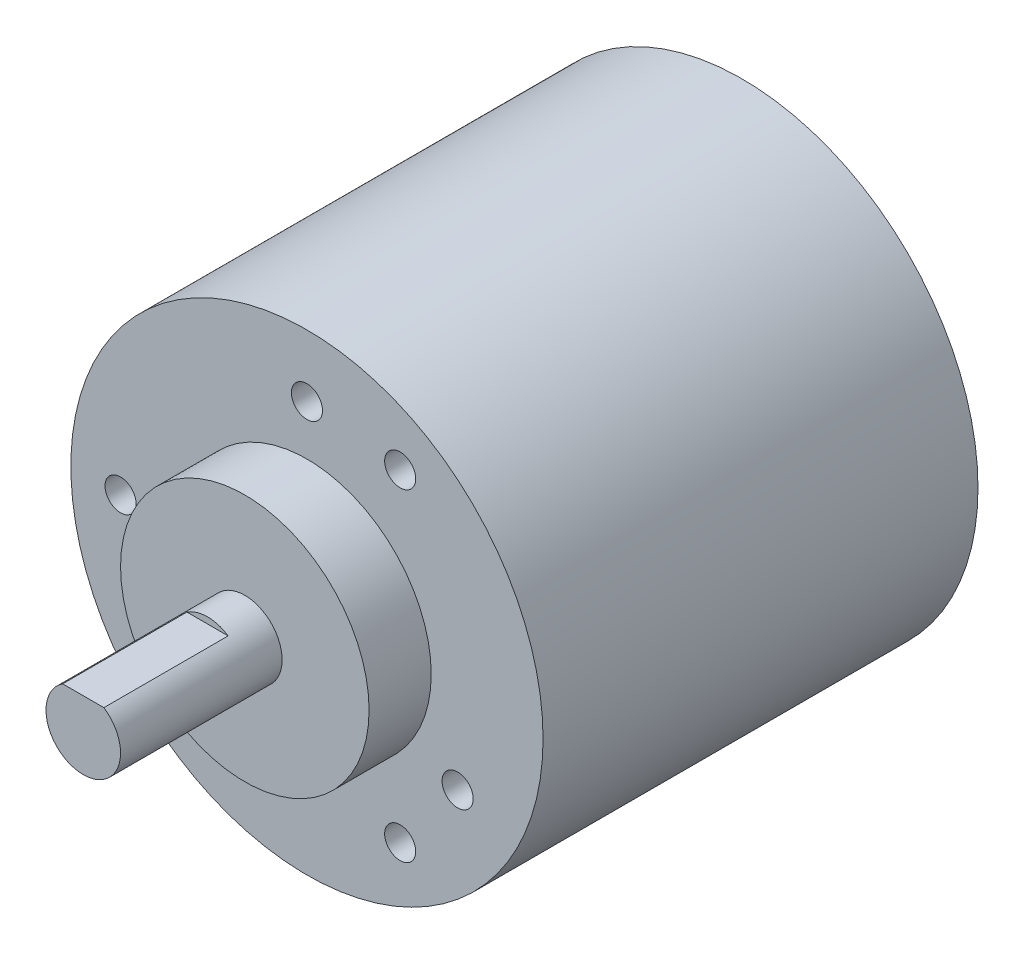
ISO-10303-21;
HEADER;
FILE_DESCRIPTION(('STEP AP214'),'2;1');
FILE_NAME('part.step','',(''),(''),'','','');
FILE_SCHEMA(('AUTOMOTIVE_DESIGN { 1 0 10303 214 1 1 1 1 }'));
ENDSEC;
DATA;
#1=APPLICATION_CONTEXT('core data for automotive mechanical design processes');
#2=APPLICATION_PROTOCOL_DEFINITION('international standard','automotive_design',2000,#1);
#3=PRODUCT_CONTEXT('',#1,'mechanical');
#4=PRODUCT('Part','Part','',(#3));
#5=PRODUCT_RELATED_PRODUCT_CATEGORY('part','',(#4));
#6=PRODUCT_DEFINITION_FORMATION('','',#4);
#7=PRODUCT_DEFINITION_CONTEXT('part definition',#1,'design');
#8=PRODUCT_DEFINITION('design','',#6,#7);
#9=PRODUCT_DEFINITION_SHAPE('','',#8);
#10=(LENGTH_UNIT() NAMED_UNIT(*) SI_UNIT(.MILLI.,.METRE.));
#11=(NAMED_UNIT(*) PLANE_ANGLE_UNIT() SI_UNIT($,.RADIAN.));
#12=(NAMED_UNIT(*) SI_UNIT($,.STERADIAN.) SOLID_ANGLE_UNIT());
#13=UNCERTAINTY_MEASURE_WITH_UNIT(LENGTH_MEASURE(1.E-05),#10,'distance_accuracy_value','');
#14=(GEOMETRIC_REPRESENTATION_CONTEXT(3) GLOBAL_UNCERTAINTY_ASSIGNED_CONTEXT((#13)) GLOBAL_UNIT_ASSIGNED_CONTEXT((#10,
#11,#12)) REPRESENTATION_CONTEXT('',''));
#15=CARTESIAN_POINT('',(0.,0.,0.));
#16=DIRECTION('',(0.,0.,1.));
#17=DIRECTION('',(1.,0.,0.));
#18=AXIS2_PLACEMENT_3D('',#15,#16,#17);
#19=CARTESIAN_POINT('',(0.,0.,35.));
#20=DIRECTION('',(0.,0.,-1.));
#21=DIRECTION('',(-1.,0.,0.));
#22=AXIS2_PLACEMENT_3D('',#19,#20,#21);
#23=CYLINDRICAL_SURFACE('',#22,19.);
#24=CARTESIAN_POINT('',(0.,0.,35.));
#25=DIRECTION('',(0.,0.,1.));
#26=DIRECTION('',(1.,0.,0.));
#27=AXIS2_PLACEMENT_3D('',#24,#25,#26);
#28=CIRCLE('',#27,19.);
#29=CARTESIAN_POINT('',(19.,0.,35.));
#30=VERTEX_POINT('',#29);
#31=EDGE_CURVE('E173',#30,#30,#28,.T.);
#32=ORIENTED_EDGE('',*,*,#31,.F.);
#33=EDGE_LOOP('',(#32));
#34=FACE_BOUND('',#33,.T.);
#35=CARTESIAN_POINT('',(0.,0.,0.));
#36=DIRECTION('',(0.,0.,1.));
#37=DIRECTION('',(1.,0.,0.));
#38=AXIS2_PLACEMENT_3D('',#35,#36,#37);
#39=CIRCLE('',#38,19.);
#40=CARTESIAN_POINT('',(19.,0.,0.));
#41=VERTEX_POINT('',#40);
#42=EDGE_CURVE('E48',#41,#41,#39,.T.);
#43=ORIENTED_EDGE('',*,*,#42,.T.);
#44=EDGE_LOOP('',(#43));
#45=FACE_BOUND('',#44,.T.);
#46=ADVANCED_FACE('F45',(#34,#45),#23,.T.);
#47=CARTESIAN_POINT('',(0.,0.,35.));
#48=DIRECTION('',(0.,0.,1.));
#49=DIRECTION('',(1.,0.,0.));
#50=AXIS2_PLACEMENT_3D('',#47,#48,#49);
#51=PLANE('',#50);
#52=CARTESIAN_POINT('',(0.,14.,35.));
#53=DIRECTION('',(0.,0.,1.));
#54=DIRECTION('',(1.,0.,0.));
#55=AXIS2_PLACEMENT_3D('',#52,#53,#54);
#56=CIRCLE('',#55,1.24999999999999);
#57=CARTESIAN_POINT('',(1.24999999999999,14.,35.));
#58=VERTEX_POINT('',#57);
#59=EDGE_CURVE('E106',#58,#58,#56,.T.);
#60=ORIENTED_EDGE('',*,*,#59,.F.);
#61=EDGE_LOOP('',(#60));
#62=FACE_BOUND('',#61,.T.);
#63=CARTESIAN_POINT('',(7.49999999999992,12.9903810567666,35.));
#64=DIRECTION('',(0.,0.,1.));
#65=DIRECTION('',(1.,0.,0.));
#66=AXIS2_PLACEMENT_3D('',#63,#64,#65);
#67=CIRCLE('',#66,1.24999999999999);
#68=CARTESIAN_POINT('',(8.74999999999991,12.9903810567666,35.));
#69=VERTEX_POINT('',#68);
#70=EDGE_CURVE('E105',#69,#69,#67,.T.);
#71=ORIENTED_EDGE('',*,*,#70,.F.);
#72=EDGE_LOOP('',(#71));
#73=FACE_BOUND('',#72,.T.);
#74=CARTESIAN_POINT('',(12.1243556529821,-7.,35.));
#75=DIRECTION('',(0.,0.,1.));
#76=DIRECTION('',(1.,0.,0.));
#77=AXIS2_PLACEMENT_3D('',#74,#75,#76);
#78=CIRCLE('',#77,1.24999999999999);
#79=CARTESIAN_POINT('',(13.3743556529821,-7.,35.));
#80=VERTEX_POINT('',#79);
#81=EDGE_CURVE('E119',#80,#80,#78,.T.);
#82=ORIENTED_EDGE('',*,*,#81,.F.);
#83=EDGE_LOOP('',(#82));
#84=FACE_BOUND('',#83,.T.);
#85=CARTESIAN_POINT('',(7.50000000000008,-12.9903810567665,35.));
#86=DIRECTION('',(0.,0.,1.));
#87=DIRECTION('',(1.,0.,0.));
#88=AXIS2_PLACEMENT_3D('',#85,#86,#87);
#89=CIRCLE('',#88,1.24999999999999);
#90=CARTESIAN_POINT('',(8.75000000000007,-12.9903810567665,35.));
#91=VERTEX_POINT('',#90);
#92=EDGE_CURVE('E127',#91,#91,#89,.T.);
#93=ORIENTED_EDGE('',*,*,#92,.F.);
#94=EDGE_LOOP('',(#93));
#95=FACE_BOUND('',#94,.T.);
#96=CARTESIAN_POINT('',(-12.1243556529821,-7.,35.));
#97=DIRECTION('',(0.,0.,1.));
#98=DIRECTION('',(1.,0.,0.));
#99=AXIS2_PLACEMENT_3D('',#96,#97,#98);
#100=CIRCLE('',#99,1.24999999999999);
#101=CARTESIAN_POINT('',(-10.8743556529822,-7.,35.));
#102=VERTEX_POINT('',#101);
#103=EDGE_CURVE('E135',#102,#102,#100,.T.);
#104=ORIENTED_EDGE('',*,*,#103,.F.);
#105=EDGE_LOOP('',(#104));
#106=FACE_BOUND('',#105,.T.);
#107=CARTESIAN_POINT('',(-15.,-1.02362217812214E-13,35.));
#108=DIRECTION('',(0.,0.,1.));
#109=DIRECTION('',(1.,0.,0.));
#110=AXIS2_PLACEMENT_3D('',#107,#108,#109);
#111=CIRCLE('',#110,1.24999999999999);
#112=CARTESIAN_POINT('',(-13.75,-1.02362217812214E-13,35.));
#113=VERTEX_POINT('',#112);
#114=EDGE_CURVE('E143',#113,#113,#111,.T.);
#115=ORIENTED_EDGE('',*,*,#114,.F.);
#116=EDGE_LOOP('',(#115));
#117=FACE_BOUND('',#116,.T.);
#118=CARTESIAN_POINT('',(0.,0.,35.));
#119=DIRECTION('',(0.,0.,1.));
#120=DIRECTION('',(1.,0.,0.));
#121=AXIS2_PLACEMENT_3D('',#118,#119,#120);
#122=CIRCLE('',#121,10.);
#123=CARTESIAN_POINT('',(10.,0.,35.));
#124=VERTEX_POINT('',#123);
#125=EDGE_CURVE('E54',#124,#124,#122,.T.);
#126=ORIENTED_EDGE('',*,*,#125,.F.);
#127=EDGE_LOOP('',(#126));
#128=FACE_BOUND('',#127,.T.);
#129=ORIENTED_EDGE('',*,*,#31,.T.);
#130=EDGE_LOOP('',(#129));
#131=FACE_BOUND('',#130,.T.);
#132=ADVANCED_FACE('F186',(#62,#73,#84,#95,#106,#117,#128,#131),#51,.T.);
#133=CARTESIAN_POINT('',(0.,0.,0.));
#134=DIRECTION('',(0.,0.,1.));
#135=DIRECTION('',(1.,0.,0.));
#136=AXIS2_PLACEMENT_3D('',#133,#134,#135);
#137=PLANE('',#136);
#138=ORIENTED_EDGE('',*,*,#42,.F.);
#139=EDGE_LOOP('',(#138));
#140=FACE_BOUND('',#139,.T.);
#141=ADVANCED_FACE('F183',(#140),#137,.F.);
#142=CARTESIAN_POINT('',(0.,0.,40.));
#143=DIRECTION('',(0.,0.,-1.));
#144=DIRECTION('',(-1.,0.,0.));
#145=AXIS2_PLACEMENT_3D('',#142,#143,#144);
#146=CYLINDRICAL_SURFACE('',#145,10.);
#147=CARTESIAN_POINT('',(0.,0.,40.));
#148=DIRECTION('',(0.,0.,1.));
#149=DIRECTION('',(1.,0.,0.));
#150=AXIS2_PLACEMENT_3D('',#147,#148,#149);
#151=CIRCLE('',#150,10.);
#152=CARTESIAN_POINT('',(10.,0.,40.));
#153=VERTEX_POINT('',#152);
#154=EDGE_CURVE('E166',#153,#153,#151,.T.);
#155=ORIENTED_EDGE('',*,*,#154,.F.);
#156=EDGE_LOOP('',(#155));
#157=FACE_BOUND('',#156,.T.);
#158=ORIENTED_EDGE('',*,*,#125,.T.);
#159=EDGE_LOOP('',(#158));
#160=FACE_BOUND('',#159,.T.);
#161=ADVANCED_FACE('F185',(#157,#160),#146,.T.);
#162=CARTESIAN_POINT('',(0.,0.,40.));
#163=DIRECTION('',(0.,0.,1.));
#164=DIRECTION('',(1.,0.,0.));
#165=AXIS2_PLACEMENT_3D('',#162,#163,#164);
#166=PLANE('',#165);
#167=CARTESIAN_POINT('',(0.,0.,40.));
#168=DIRECTION('',(0.,0.,1.));
#169=DIRECTION('',(1.,0.,0.));
#170=AXIS2_PLACEMENT_3D('',#167,#168,#169);
#171=CIRCLE('',#170,3.);
#172=CARTESIAN_POINT('',(3.,0.,40.));
#173=VERTEX_POINT('',#172);
#174=EDGE_CURVE('E11',#173,#173,#171,.T.);
#175=ORIENTED_EDGE('',*,*,#174,.F.);
#176=EDGE_LOOP('',(#175));
#177=FACE_BOUND('',#176,.T.);
#178=ORIENTED_EDGE('',*,*,#154,.T.);
#179=EDGE_LOOP('',(#178));
#180=FACE_BOUND('',#179,.T.);
#181=ADVANCED_FACE('F191',(#177,#180),#166,.T.);
#182=CARTESIAN_POINT('',(0.,0.,53.));
#183=DIRECTION('',(0.,0.,-1.));
#184=DIRECTION('',(-1.,0.,0.));
#185=AXIS2_PLACEMENT_3D('',#182,#183,#184);
#186=CYLINDRICAL_SURFACE('',#185,3.);
#187=CARTESIAN_POINT('',(0.,0.,53.));
#188=DIRECTION('',(0.,0.,1.));
#189=DIRECTION('',(1.,0.,0.));
#190=AXIS2_PLACEMENT_3D('',#187,#188,#189);
#191=CIRCLE('',#190,3.);
#192=CARTESIAN_POINT('',(-1.6583123951777,2.5,53.));
#193=VERTEX_POINT('',#192);
#194=CARTESIAN_POINT('',(1.6583123951777,2.5,53.));
#195=VERTEX_POINT('',#194);
#196=EDGE_CURVE('E161',#193,#195,#191,.T.);
#197=ORIENTED_EDGE('',*,*,#196,.F.);
#198=DIRECTION('',(0.,0.,1.));
#199=VECTOR('',#198,1.);
#200=CARTESIAN_POINT('',(-1.6583123951777,2.5,43.));
#201=LINE('',#200,#199);
#202=CARTESIAN_POINT('',(-1.6583123951777,2.5,43.));
#203=VERTEX_POINT('',#202);
#204=EDGE_CURVE('E62',#203,#193,#201,.T.);
#205=ORIENTED_EDGE('',*,*,#204,.F.);
#206=CARTESIAN_POINT('',(0.,0.,43.));
#207=DIRECTION('',(0.,0.,1.));
#208=DIRECTION('',(1.,0.,0.));
#209=AXIS2_PLACEMENT_3D('',#206,#207,#208);
#210=CIRCLE('',#209,3.);
#211=CARTESIAN_POINT('',(1.6583123951777,2.5,43.));
#212=VERTEX_POINT('',#211);
#213=EDGE_CURVE('E151',#212,#203,#210,.T.);
#214=ORIENTED_EDGE('',*,*,#213,.F.);
#215=DIRECTION('',(0.,0.,1.));
#216=VECTOR('',#215,1.);
#217=CARTESIAN_POINT('',(1.6583123951777,2.5,43.));
#218=LINE('',#217,#216);
#219=EDGE_CURVE('E68',#212,#195,#218,.T.);
#220=ORIENTED_EDGE('',*,*,#219,.T.);
#221=EDGE_LOOP('',(#197,#205,#214,#220));
#222=FACE_BOUND('',#221,.T.);
#223=ORIENTED_EDGE('',*,*,#174,.T.);
#224=EDGE_LOOP('',(#223));
#225=FACE_BOUND('',#224,.T.);
#226=ADVANCED_FACE('F335',(#222,#225),#186,.T.);
#227=CARTESIAN_POINT('',(0.,0.,53.));
#228=DIRECTION('',(0.,0.,1.));
#229=DIRECTION('',(1.,0.,0.));
#230=AXIS2_PLACEMENT_3D('',#227,#228,#229);
#231=PLANE('',#230);
#232=DIRECTION('',(1.,0.,0.));
#233=VECTOR('',#232,1.);
#234=CARTESIAN_POINT('',(-1.6583123951777,2.5,53.));
#235=LINE('',#234,#233);
#236=EDGE_CURVE('E75',#193,#195,#235,.T.);
#237=ORIENTED_EDGE('',*,*,#236,.F.);
#238=ORIENTED_EDGE('',*,*,#196,.T.);
#239=EDGE_LOOP('',(#237,#238));
#240=FACE_BOUND('',#239,.T.);
#241=ADVANCED_FACE('F328',(#240),#231,.T.);
#242=CARTESIAN_POINT('',(-1.6583123951777,2.5,43.));
#243=DIRECTION('',(0.,-1.,0.));
#244=DIRECTION('',(0.,0.,-1.));
#245=AXIS2_PLACEMENT_3D('',#242,#243,#244);
#246=PLANE('',#245);
#247=ORIENTED_EDGE('',*,*,#236,.T.);
#248=ORIENTED_EDGE('',*,*,#219,.F.);
#249=DIRECTION('',(1.,0.,0.));
#250=VECTOR('',#249,1.);
#251=CARTESIAN_POINT('',(-1.6583123951777,2.5,43.));
#252=LINE('',#251,#250);
#253=EDGE_CURVE('E154',#203,#212,#252,.T.);
#254=ORIENTED_EDGE('',*,*,#253,.F.);
#255=ORIENTED_EDGE('',*,*,#204,.T.);
#256=EDGE_LOOP('',(#247,#248,#254,#255));
#257=FACE_BOUND('',#256,.T.);
#258=ADVANCED_FACE('F320',(#257),#246,.F.);
#259=CARTESIAN_POINT('',(0.,0.,43.));
#260=DIRECTION('',(0.,0.,1.));
#261=DIRECTION('',(1.,0.,0.));
#262=AXIS2_PLACEMENT_3D('',#259,#260,#261);
#263=PLANE('',#262);
#264=ORIENTED_EDGE('',*,*,#213,.T.);
#265=ORIENTED_EDGE('',*,*,#253,.T.);
#266=EDGE_LOOP('',(#264,#265));
#267=FACE_BOUND('',#266,.T.);
#268=ADVANCED_FACE('F312',(#267),#263,.T.);
#269=CARTESIAN_POINT('',(-15.,-1.02362217812214E-13,27.5));
#270=DIRECTION('',(0.,0.,1.));
#271=DIRECTION('',(1.,0.,0.));
#272=AXIS2_PLACEMENT_3D('',#269,#270,#271);
#273=CONICAL_SURFACE('',#272,1.25,1.02974425867665);
#274=CARTESIAN_POINT('',(-15.,-1.02362217812214E-13,26.7489242262156));
#275=VERTEX_POINT('',#274);
#276=VERTEX_LOOP('',#275);
#277=FACE_BOUND('',#276,.T.);
#278=CARTESIAN_POINT('',(-15.,-1.02362217812214E-13,27.5));
#279=DIRECTION('',(0.,0.,1.));
#280=DIRECTION('',(1.,0.,0.));
#281=AXIS2_PLACEMENT_3D('',#278,#279,#280);
#282=CIRCLE('',#281,1.25);
#283=CARTESIAN_POINT('',(-13.75,-1.02362217812214E-13,27.5));
#284=VERTEX_POINT('',#283);
#285=EDGE_CURVE('E147',#284,#284,#282,.T.);
#286=ORIENTED_EDGE('',*,*,#285,.T.);
#287=EDGE_LOOP('',(#286));
#288=FACE_BOUND('',#287,.T.);
#289=ADVANCED_FACE('F303',(#277,#288),#273,.F.);
#290=CARTESIAN_POINT('',(-15.,-1.02362217812214E-13,35.));
#291=DIRECTION('',(0.,0.,1.));
#292=DIRECTION('',(1.,0.,0.));
#293=AXIS2_PLACEMENT_3D('',#290,#291,#292);
#294=CYLINDRICAL_SURFACE('',#293,1.24999999999999);
#295=ORIENTED_EDGE('',*,*,#285,.F.);
#296=EDGE_LOOP('',(#295));
#297=FACE_BOUND('',#296,.T.);
#298=ORIENTED_EDGE('',*,*,#114,.T.);
#299=EDGE_LOOP('',(#298));
#300=FACE_BOUND('',#299,.T.);
#301=ADVANCED_FACE('F294',(#297,#300),#294,.F.);
#302=CARTESIAN_POINT('',(-12.1243556529821,-7.,27.5));
#303=DIRECTION('',(0.,0.,1.));
#304=DIRECTION('',(1.,0.,0.));
#305=AXIS2_PLACEMENT_3D('',#302,#303,#304);
#306=CONICAL_SURFACE('',#305,1.25,1.02974425867665);
#307=CARTESIAN_POINT('',(-12.1243556529821,-7.,26.7489242262156));
#308=VERTEX_POINT('',#307);
#309=VERTEX_LOOP('',#308);
#310=FACE_BOUND('',#309,.T.);
#311=CARTESIAN_POINT('',(-12.1243556529821,-7.,27.5));
#312=DIRECTION('',(0.,0.,1.));
#313=DIRECTION('',(1.,0.,0.));
#314=AXIS2_PLACEMENT_3D('',#311,#312,#313);
#315=CIRCLE('',#314,1.25);
#316=CARTESIAN_POINT('',(-10.8743556529821,-7.,27.5));
#317=VERTEX_POINT('',#316);
#318=EDGE_CURVE('E139',#317,#317,#315,.T.);
#319=ORIENTED_EDGE('',*,*,#318,.T.);
#320=EDGE_LOOP('',(#319));
#321=FACE_BOUND('',#320,.T.);
#322=ADVANCED_FACE('F284',(#310,#321),#306,.F.);
#323=CARTESIAN_POINT('',(-12.1243556529821,-7.,35.));
#324=DIRECTION('',(0.,0.,1.));
#325=DIRECTION('',(1.,0.,0.));
#326=AXIS2_PLACEMENT_3D('',#323,#324,#325);
#327=CYLINDRICAL_SURFACE('',#326,1.24999999999999);
#328=ORIENTED_EDGE('',*,*,#318,.F.);
#329=EDGE_LOOP('',(#328));
#330=FACE_BOUND('',#329,.T.);
#331=ORIENTED_EDGE('',*,*,#103,.T.);
#332=EDGE_LOOP('',(#331));
#333=FACE_BOUND('',#332,.T.);
#334=ADVANCED_FACE('F275',(#330,#333),#327,.F.);
#335=CARTESIAN_POINT('',(7.50000000000008,-12.9903810567665,27.5));
#336=DIRECTION('',(0.,0.,1.));
#337=DIRECTION('',(1.,0.,0.));
#338=AXIS2_PLACEMENT_3D('',#335,#336,#337);
#339=CONICAL_SURFACE('',#338,1.25,1.02974425867665);
#340=CARTESIAN_POINT('',(7.50000000000008,-12.9903810567665,26.7489242262156));
#341=VERTEX_POINT('',#340);
#342=VERTEX_LOOP('',#341);
#343=FACE_BOUND('',#342,.T.);
#344=CARTESIAN_POINT('',(7.50000000000008,-12.9903810567665,27.5));
#345=DIRECTION('',(0.,0.,1.));
#346=DIRECTION('',(1.,0.,0.));
#347=AXIS2_PLACEMENT_3D('',#344,#345,#346);
#348=CIRCLE('',#347,1.25);
#349=CARTESIAN_POINT('',(8.75000000000008,-12.9903810567665,27.5));
#350=VERTEX_POINT('',#349);
#351=EDGE_CURVE('E131',#350,#350,#348,.T.);
#352=ORIENTED_EDGE('',*,*,#351,.T.);
#353=EDGE_LOOP('',(#352));
#354=FACE_BOUND('',#353,.T.);
#355=ADVANCED_FACE('F265',(#343,#354),#339,.F.);
#356=CARTESIAN_POINT('',(7.50000000000008,-12.9903810567665,35.));
#357=DIRECTION('',(0.,0.,1.));
#358=DIRECTION('',(1.,0.,0.));
#359=AXIS2_PLACEMENT_3D('',#356,#357,#358);
#360=CYLINDRICAL_SURFACE('',#359,1.24999999999999);
#361=ORIENTED_EDGE('',*,*,#351,.F.);
#362=EDGE_LOOP('',(#361));
#363=FACE_BOUND('',#362,.T.);
#364=ORIENTED_EDGE('',*,*,#92,.T.);
#365=EDGE_LOOP('',(#364));
#366=FACE_BOUND('',#365,.T.);
#367=ADVANCED_FACE('F256',(#363,#366),#360,.F.);
#368=CARTESIAN_POINT('',(12.1243556529821,-7.,27.5));
#369=DIRECTION('',(0.,0.,1.));
#370=DIRECTION('',(1.,0.,0.));
#371=AXIS2_PLACEMENT_3D('',#368,#369,#370);
#372=CONICAL_SURFACE('',#371,1.25,1.02974425867665);
#373=CARTESIAN_POINT('',(12.1243556529821,-7.,26.7489242262156));
#374=VERTEX_POINT('',#373);
#375=VERTEX_LOOP('',#374);
#376=FACE_BOUND('',#375,.T.);
#377=CARTESIAN_POINT('',(12.1243556529821,-7.,27.5));
#378=DIRECTION('',(0.,0.,1.));
#379=DIRECTION('',(1.,0.,0.));
#380=AXIS2_PLACEMENT_3D('',#377,#378,#379);
#381=CIRCLE('',#380,1.25);
#382=CARTESIAN_POINT('',(13.3743556529821,-7.,27.5));
#383=VERTEX_POINT('',#382);
#384=EDGE_CURVE('E123',#383,#383,#381,.T.);
#385=ORIENTED_EDGE('',*,*,#384,.T.);
#386=EDGE_LOOP('',(#385));
#387=FACE_BOUND('',#386,.T.);
#388=ADVANCED_FACE('F246',(#376,#387),#372,.F.);
#389=CARTESIAN_POINT('',(12.1243556529821,-7.,35.));
#390=DIRECTION('',(0.,0.,1.));
#391=DIRECTION('',(1.,0.,0.));
#392=AXIS2_PLACEMENT_3D('',#389,#390,#391);
#393=CYLINDRICAL_SURFACE('',#392,1.24999999999999);
#394=ORIENTED_EDGE('',*,*,#384,.F.);
#395=EDGE_LOOP('',(#394));
#396=FACE_BOUND('',#395,.T.);
#397=ORIENTED_EDGE('',*,*,#81,.T.);
#398=EDGE_LOOP('',(#397));
#399=FACE_BOUND('',#398,.T.);
#400=ADVANCED_FACE('F237',(#396,#399),#393,.F.);
#401=CARTESIAN_POINT('',(7.49999999999992,12.9903810567666,27.5));
#402=DIRECTION('',(0.,0.,1.));
#403=DIRECTION('',(1.,0.,0.));
#404=AXIS2_PLACEMENT_3D('',#401,#402,#403);
#405=CONICAL_SURFACE('',#404,1.25,1.02974425867665);
#406=CARTESIAN_POINT('',(7.49999999999992,12.9903810567666,26.7489242262156));
#407=VERTEX_POINT('',#406);
#408=VERTEX_LOOP('',#407);
#409=FACE_BOUND('',#408,.T.);
#410=CARTESIAN_POINT('',(7.49999999999992,12.9903810567666,27.5));
#411=DIRECTION('',(0.,0.,1.));
#412=DIRECTION('',(1.,0.,0.));
#413=AXIS2_PLACEMENT_3D('',#410,#411,#412);
#414=CIRCLE('',#413,1.25);
#415=CARTESIAN_POINT('',(8.74999999999991,12.9903810567666,27.5));
#416=VERTEX_POINT('',#415);
#417=EDGE_CURVE('E111',#416,#416,#414,.T.);
#418=ORIENTED_EDGE('',*,*,#417,.T.);
#419=EDGE_LOOP('',(#418));
#420=FACE_BOUND('',#419,.T.);
#421=ADVANCED_FACE('F229',(#409,#420),#405,.F.);
#422=CARTESIAN_POINT('',(7.49999999999992,12.9903810567666,35.));
#423=DIRECTION('',(0.,0.,1.));
#424=DIRECTION('',(1.,0.,0.));
#425=AXIS2_PLACEMENT_3D('',#422,#423,#424);
#426=CYLINDRICAL_SURFACE('',#425,1.24999999999999);
#427=ORIENTED_EDGE('',*,*,#417,.F.);
#428=EDGE_LOOP('',(#427));
#429=FACE_BOUND('',#428,.T.);
#430=ORIENTED_EDGE('',*,*,#70,.T.);
#431=EDGE_LOOP('',(#430));
#432=FACE_BOUND('',#431,.T.);
#433=ADVANCED_FACE('F98',(#429,#432),#426,.F.);
#434=CARTESIAN_POINT('',(0.,14.,27.5));
#435=DIRECTION('',(0.,0.,1.));
#436=DIRECTION('',(1.,0.,0.));
#437=AXIS2_PLACEMENT_3D('',#434,#435,#436);
#438=CONICAL_SURFACE('',#437,1.25,1.02974425867665);
#439=CARTESIAN_POINT('',(0.,14.,26.7489242262156));
#440=VERTEX_POINT('',#439);
#441=VERTEX_LOOP('',#440);
#442=FACE_BOUND('',#441,.T.);
#443=CARTESIAN_POINT('',(0.,14.,27.5));
#444=DIRECTION('',(0.,0.,1.));
#445=DIRECTION('',(1.,0.,0.));
#446=AXIS2_PLACEMENT_3D('',#443,#444,#445);
#447=CIRCLE('',#446,1.25);
#448=CARTESIAN_POINT('',(1.25,14.,27.5));
#449=VERTEX_POINT('',#448);
#450=EDGE_CURVE('E102',#449,#449,#447,.T.);
#451=ORIENTED_EDGE('',*,*,#450,.T.);
#452=EDGE_LOOP('',(#451));
#453=FACE_BOUND('',#452,.T.);
#454=ADVANCED_FACE('F94',(#442,#453),#438,.F.);
#455=CARTESIAN_POINT('',(0.,14.,35.));
#456=DIRECTION('',(0.,0.,1.));
#457=DIRECTION('',(1.,0.,0.));
#458=AXIS2_PLACEMENT_3D('',#455,#456,#457);
#459=CYLINDRICAL_SURFACE('',#458,1.24999999999999);
#460=ORIENTED_EDGE('',*,*,#450,.F.);
#461=EDGE_LOOP('',(#460));
#462=FACE_BOUND('',#461,.T.);
#463=ORIENTED_EDGE('',*,*,#59,.T.);
#464=EDGE_LOOP('',(#463));
#465=FACE_BOUND('',#464,.T.);
#466=ADVANCED_FACE('F97',(#462,#465),#459,.F.);
#467=CLOSED_SHELL('',(#46,#132,#141,#161,#181,#226,#241,#258,#268,#289,#301,#322,#334,#355,#367,
#388,#400,#421,#433,#454,#466));
#468=MANIFOLD_SOLID_BREP('B2',#467);
#469=ADVANCED_BREP_SHAPE_REPRESENTATION('',(#18,#468),#14);
#470=SHAPE_DEFINITION_REPRESENTATION(#9,#469);
ENDSEC;
END-ISO-10303-21;
